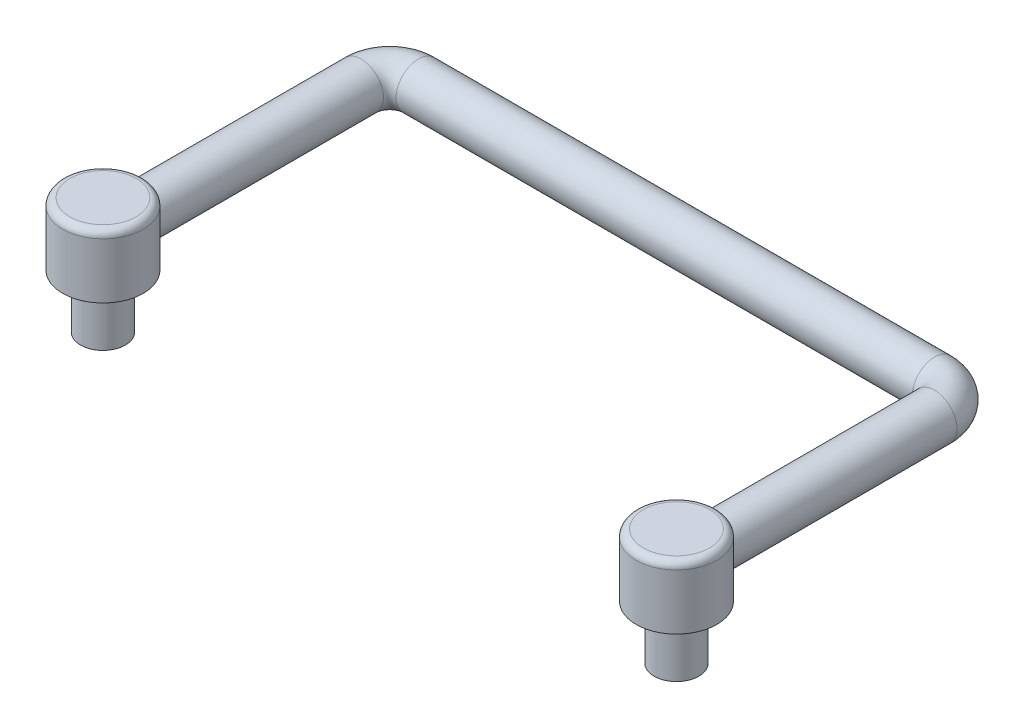
ISO-10303-21;
HEADER;
FILE_DESCRIPTION(('STEP AP214'),'2;1');
FILE_NAME('part.step','',(''),(''),'','','');
FILE_SCHEMA(('AUTOMOTIVE_DESIGN { 1 0 10303 214 1 1 1 1 }'));
ENDSEC;
DATA;
#1=APPLICATION_CONTEXT('core data for automotive mechanical design processes');
#2=APPLICATION_PROTOCOL_DEFINITION('international standard','automotive_design',2000,#1);
#3=PRODUCT_CONTEXT('',#1,'mechanical');
#4=PRODUCT('Part','Part','',(#3));
#5=PRODUCT_RELATED_PRODUCT_CATEGORY('part','',(#4));
#6=PRODUCT_DEFINITION_FORMATION('','',#4);
#7=PRODUCT_DEFINITION_CONTEXT('part definition',#1,'design');
#8=PRODUCT_DEFINITION('design','',#6,#7);
#9=PRODUCT_DEFINITION_SHAPE('','',#8);
#10=(LENGTH_UNIT() NAMED_UNIT(*) SI_UNIT(.MILLI.,.METRE.));
#11=(NAMED_UNIT(*) PLANE_ANGLE_UNIT() SI_UNIT($,.RADIAN.));
#12=(NAMED_UNIT(*) SI_UNIT($,.STERADIAN.) SOLID_ANGLE_UNIT());
#13=UNCERTAINTY_MEASURE_WITH_UNIT(LENGTH_MEASURE(1.E-05),#10,'distance_accuracy_value','');
#14=(GEOMETRIC_REPRESENTATION_CONTEXT(3) GLOBAL_UNCERTAINTY_ASSIGNED_CONTEXT((#13)) GLOBAL_UNIT_ASSIGNED_CONTEXT((#10,
#11,#12)) REPRESENTATION_CONTEXT('',''));
#15=CARTESIAN_POINT('',(0.,0.,0.));
#16=DIRECTION('',(0.,0.,1.));
#17=DIRECTION('',(1.,0.,0.));
#18=AXIS2_PLACEMENT_3D('',#15,#16,#17);
#19=CARTESIAN_POINT('',(101.6,-5.55625,0.));
#20=DIRECTION('',(0.,1.,0.));
#21=DIRECTION('',(0.,0.,1.));
#22=AXIS2_PLACEMENT_3D('',#19,#20,#21);
#23=PLANE('',#22);
#24=CARTESIAN_POINT('',(101.6,-5.55625,0.));
#25=DIRECTION('',(0.,1.,0.));
#26=DIRECTION('',(0.,0.,1.));
#27=AXIS2_PLACEMENT_3D('',#24,#25,#26);
#28=CIRCLE('',#27,7.14375);
#29=CARTESIAN_POINT('',(101.6,-5.55625,7.14375000000002));
#30=VERTEX_POINT('',#29);
#31=EDGE_CURVE('E115',#30,#30,#28,.T.);
#32=ORIENTED_EDGE('',*,*,#31,.F.);
#33=EDGE_LOOP('',(#32));
#34=FACE_BOUND('',#33,.T.);
#35=CARTESIAN_POINT('',(101.6,-5.55625,0.));
#36=DIRECTION('',(0.,1.,0.));
#37=DIRECTION('',(0.,0.,1.));
#38=AXIS2_PLACEMENT_3D('',#35,#36,#37);
#39=CIRCLE('',#38,3.96874999999999);
#40=CARTESIAN_POINT('',(101.6,-5.55625,3.96875));
#41=VERTEX_POINT('',#40);
#42=EDGE_CURVE('E49',#41,#41,#39,.F.);
#43=ORIENTED_EDGE('',*,*,#42,.F.);
#44=EDGE_LOOP('',(#43));
#45=FACE_BOUND('',#44,.T.);
#46=ADVANCED_FACE('F29',(#34,#45),#23,.F.);
#47=CARTESIAN_POINT('',(0.,-5.55625,0.));
#48=DIRECTION('',(0.,1.,0.));
#49=DIRECTION('',(0.,0.,1.));
#50=AXIS2_PLACEMENT_3D('',#47,#48,#49);
#51=PLANE('',#50);
#52=CARTESIAN_POINT('',(0.,-5.55625,0.));
#53=DIRECTION('',(0.,1.,0.));
#54=DIRECTION('',(0.,0.,1.));
#55=AXIS2_PLACEMENT_3D('',#52,#53,#54);
#56=CIRCLE('',#55,7.14375);
#57=CARTESIAN_POINT('',(0.,-5.55625,7.14375));
#58=VERTEX_POINT('',#57);
#59=EDGE_CURVE('E171',#58,#58,#56,.T.);
#60=ORIENTED_EDGE('',*,*,#59,.F.);
#61=EDGE_LOOP('',(#60));
#62=FACE_BOUND('',#61,.T.);
#63=CARTESIAN_POINT('',(0.,-5.55625,0.));
#64=DIRECTION('',(0.,1.,0.));
#65=DIRECTION('',(0.,0.,1.));
#66=AXIS2_PLACEMENT_3D('',#63,#64,#65);
#67=CIRCLE('',#66,3.96875);
#68=CARTESIAN_POINT('',(0.,-5.55625,3.96875));
#69=VERTEX_POINT('',#68);
#70=EDGE_CURVE('E52',#69,#69,#67,.F.);
#71=ORIENTED_EDGE('',*,*,#70,.F.);
#72=EDGE_LOOP('',(#71));
#73=FACE_BOUND('',#72,.T.);
#74=ADVANCED_FACE('F84',(#62,#73),#51,.F.);
#75=CARTESIAN_POINT('',(101.6,0.,-45.72));
#76=DIRECTION('',(0.,0.,1.));
#77=DIRECTION('',(1.,0.,0.));
#78=AXIS2_PLACEMENT_3D('',#75,#76,#77);
#79=CYLINDRICAL_SURFACE('',#78,3.96875);
#80=CARTESIAN_POINT('',(101.6,0.,-45.72));
#81=DIRECTION('',(0.,0.,-1.));
#82=DIRECTION('',(-1.,0.,0.));
#83=AXIS2_PLACEMENT_3D('',#80,#81,#82);
#84=CIRCLE('',#83,3.96875);
#85=CARTESIAN_POINT('',(105.56875,0.,-45.72));
#86=VERTEX_POINT('',#85);
#87=EDGE_CURVE('E62',#86,#86,#84,.T.);
#88=ORIENTED_EDGE('',*,*,#87,.F.);
#89=EDGE_LOOP('',(#88));
#90=FACE_BOUND('',#89,.T.);
#91=CARTESIAN_POINT('',(105.56875,0.,-5.93988110150362));
#92=CARTESIAN_POINT('',(105.568751409648,0.10154310785879,-5.93987919856));
#93=CARTESIAN_POINT('',(105.564848387252,0.203071550308421,-5.94249330192825));
#94=CARTESIAN_POINT('',(105.549302464966,0.405305419892145,-5.95283656101962));
#95=CARTESIAN_POINT('',(105.537657164327,0.506010581932672,-5.96056730332322));
#96=CARTESIAN_POINT('',(105.506782827201,0.70587533695,-5.98084875449036));
#97=CARTESIAN_POINT('',(105.487545031828,0.805033006872294,-5.99340502976651));
#98=CARTESIAN_POINT('',(105.441758711905,1.00100406381826,-6.02285561518068));
#99=CARTESIAN_POINT('',(105.41520690329,1.09781637645862,-6.03975187378329));
#100=CARTESIAN_POINT('',(105.325453479869,1.38250513248704,-6.09582993196987));
#101=CARTESIAN_POINT('',(105.251914916521,1.56613804072142,-6.14056849470107));
#102=CARTESIAN_POINT('',(105.079895377524,1.91828274678916,-6.23965517686694));
#103=CARTESIAN_POINT('',(104.981408861789,2.08679117472214,-6.29400542991858));
#104=CARTESIAN_POINT('',(104.750401224694,2.42317152934555,-6.41301136089922));
#105=CARTESIAN_POINT('',(104.615415402754,2.58917992122099,-6.47815163277469));
#106=CARTESIAN_POINT('',(104.320210094102,2.8977596971409,-6.60753735867565));
#107=CARTESIAN_POINT('',(104.159975271224,3.04031672863135,-6.67178224286228));
#108=CARTESIAN_POINT('',(103.895261893814,3.23981871057335,-6.765706829505));
#109=CARTESIAN_POINT('',(103.798611521444,3.30619219897231,-6.79780684441846));
#110=CARTESIAN_POINT('',(103.599162006307,3.43046896749411,-6.85910912065808));
#111=CARTESIAN_POINT('',(103.496365572429,3.48837594103726,-6.88831264374664));
#112=CARTESIAN_POINT('',(103.285258157871,3.59511738577668,-6.94297897014567));
#113=CARTESIAN_POINT('',(103.176949056945,3.64395492348432,-6.96844303721043));
#114=CARTESIAN_POINT('',(102.955546671429,3.73197722471938,-7.01487291628941));
#115=CARTESIAN_POINT('',(102.842454041393,3.77116330392791,-7.03583934136919));
#116=CARTESIAN_POINT('',(102.62213514465,3.83644107496012,-7.0710521748939));
#117=CARTESIAN_POINT('',(102.515220280813,3.86335924904474,-7.08571662347745));
#118=CARTESIAN_POINT('',(102.299000406175,3.90826849709986,-7.11030210802229));
#119=CARTESIAN_POINT('',(102.18969569487,3.9262606830545,-7.12022373483049));
#120=CARTESIAN_POINT('',(101.969693017797,3.95304636491659,-7.13502896605437));
#121=CARTESIAN_POINT('',(101.858995950662,3.96184551385102,-7.13991566654584));
#122=CARTESIAN_POINT('',(101.637151780249,3.97012793363459,-7.14451476562938));
#123=CARTESIAN_POINT('',(101.526004714364,3.96961196327747,-7.14422758567695));
#124=CARTESIAN_POINT('',(101.316161780101,3.9598270499417,-7.13879565087735));
#125=CARTESIAN_POINT('',(101.217407319422,3.95150149099343,-7.13417444873328));
#126=CARTESIAN_POINT('',(101.02105161751,3.92754318739781,-7.12093323406999));
#127=CARTESIAN_POINT('',(100.923450742155,3.91190818499788,-7.11231198601641));
#128=CARTESIAN_POINT('',(100.633471359293,3.85428789443376,-7.08072293600312));
#129=CARTESIAN_POINT('',(100.443720435358,3.80157777901108,-7.05202420805719));
#130=CARTESIAN_POINT('',(100.074414768247,3.66913258521544,-6.98151645479386));
#131=CARTESIAN_POINT('',(99.8949853294221,3.58912446039571,-6.93957530227558));
#132=CARTESIAN_POINT('',(99.5517352535383,3.40493014905276,-6.8461256186277));
#133=CARTESIAN_POINT('',(99.3879195423039,3.30073636781079,-6.7946140832469));
#134=CARTESIAN_POINT('',(99.0614322508916,3.05817012995434,-6.67996637541492));
#135=CARTESIAN_POINT('',(98.900840585291,2.91730736159206,-6.61617503366157));
#136=CARTESIAN_POINT('',(98.6043317141428,2.61196419245336,-6.4873204488594));
#137=CARTESIAN_POINT('',(98.4684409422316,2.44745882365875,-6.42225592480702));
#138=CARTESIAN_POINT('',(98.2127972464814,2.0813383462949,-6.2914593154622));
#139=CARTESIAN_POINT('',(98.0956270365767,1.87771048896516,-6.22620223726104));
#140=CARTESIAN_POINT('',(97.9474346904629,1.55681207299698,-6.13964318904894));
#141=CARTESIAN_POINT('',(97.9026255540995,1.44724897088753,-6.11267414648955));
#142=CARTESIAN_POINT('',(97.822721699869,1.22360718622362,-6.06362342643157));
#143=CARTESIAN_POINT('',(97.7876203433208,1.10953165082781,-6.04153841106421));
#144=CARTESIAN_POINT('',(97.7300735079042,0.887007581895807,-6.00482353308846));
#145=CARTESIAN_POINT('',(97.706841220248,0.778837159017298,-5.98973916657484));
#146=CARTESIAN_POINT('',(97.6694467104203,0.56035502928333,-5.96526755517972));
#147=CARTESIAN_POINT('',(97.655279147908,0.450044622709229,-5.95587695607541));
#148=CARTESIAN_POINT('',(97.6362646922972,0.228356015312485,-5.94323970930252));
#149=CARTESIAN_POINT('',(97.6314106086422,0.11697870502874,-5.9399883218303));
#150=CARTESIAN_POINT('',(97.6310972810745,-0.105787202868149,-5.93977915336859));
#151=CARTESIAN_POINT('',(97.6356369584761,-0.217175797716791,-5.9428206497671));
#152=CARTESIAN_POINT('',(97.6526366712029,-0.422175562040225,-5.95412209058083));
#153=CARTESIAN_POINT('',(97.6638047919883,-0.515944203638261,-5.96152969931841));
#154=CARTESIAN_POINT('',(97.6927011627008,-0.702048989504742,-5.98050770689929));
#155=CARTESIAN_POINT('',(97.7104315019882,-0.794384667761983,-5.9920794315328));
#156=CARTESIAN_POINT('',(97.7731682767473,-1.06834926637936,-6.03249916790604));
#157=CARTESIAN_POINT('',(97.8277298045571,-1.24704468952756,-6.06705843576853));
#158=CARTESIAN_POINT('',(97.9628650614989,-1.59982853618998,-6.14905293613567));
#159=CARTESIAN_POINT('',(98.0444188951653,-1.77342291253662,-6.19696046996845));
#160=CARTESIAN_POINT('',(98.2304378888948,-2.10553283559213,-6.30004107791264));
#161=CARTESIAN_POINT('',(98.3349142323768,-2.26404096772315,-6.35521769319037));
#162=CARTESIAN_POINT('',(98.5834738942484,-2.58840252145041,-6.47733612579224));
#163=CARTESIAN_POINT('',(98.7312333803934,-2.75127279507138,-6.54473401500145));
#164=CARTESIAN_POINT('',(99.0525591147211,-3.05119240844771,-6.67636096356092));
#165=CARTESIAN_POINT('',(99.226141192569,-3.18822579211152,-6.7405880467628));
#166=CARTESIAN_POINT('',(99.5083355985158,-3.37484663552342,-6.83144476868775));
#167=CARTESIAN_POINT('',(99.6088997385732,-3.43516165884034,-6.86150170823629));
#168=CARTESIAN_POINT('',(99.8157180785893,-3.54698669524419,-6.91816249829271));
#169=CARTESIAN_POINT('',(99.9219697063907,-3.59850064514978,-6.94476789142744));
#170=CARTESIAN_POINT('',(100.139409949139,-3.69210760070062,-6.9937298256553));
#171=CARTESIAN_POINT('',(100.250595559139,-3.73420624868883,-7.01608891023107));
#172=CARTESIAN_POINT('',(100.477097453947,-3.80844609745222,-7.05588161331109));
#173=CARTESIAN_POINT('',(100.592413108438,-3.8405888105123,-7.07331597983386));
#174=CARTESIAN_POINT('',(100.814130028827,-3.89165340873626,-7.10117921080758));
#175=CARTESIAN_POINT('',(100.920230191597,-3.91159420813783,-7.11214373453954));
#176=CARTESIAN_POINT('',(101.134075136952,-3.94278609654451,-7.12934635501571));
#177=CARTESIAN_POINT('',(101.241819737596,-3.95403813986927,-7.13558497082322));
#178=CARTESIAN_POINT('',(101.457992898749,-3.96768634751504,-7.14315688048232));
#179=CARTESIAN_POINT('',(101.566421137186,-3.97008640932122,-7.14449233317205));
#180=CARTESIAN_POINT('',(101.783054057641,-3.96600604327453,-7.14222574398426));
#181=CARTESIAN_POINT('',(101.891258751222,-3.95952608685848,-7.13862396422255));
#182=CARTESIAN_POINT('',(102.096544820916,-3.93878842848649,-7.12714350316994));
#183=CARTESIAN_POINT('',(102.193729174876,-3.92530571566202,-7.11969131001741));
#184=CARTESIAN_POINT('',(102.386491826716,-3.89127257963581,-7.10098540561767));
#185=CARTESIAN_POINT('',(102.482069577598,-3.87071979844071,-7.08973042609597));
#186=CARTESIAN_POINT('',(102.765384914079,-3.79878041948039,-7.05062076933277));
#187=CARTESIAN_POINT('',(102.949885471299,-3.737094053141,-7.01741059308218));
#188=CARTESIAN_POINT('',(103.311589190027,-3.58624701809033,-6.93823598323555));
#189=CARTESIAN_POINT('',(103.488353468391,-3.49625030730817,-6.89188837475215));
#190=CARTESIAN_POINT('',(103.82485575425,-3.29237371819386,-6.79073440624468));
#191=CARTESIAN_POINT('',(103.984587014079,-3.17848442739124,-6.73592471484089));
#192=CARTESIAN_POINT('',(104.302211921362,-2.91486419931205,-6.61538535704771));
#193=CARTESIAN_POINT('',(104.457726790535,-2.7625042114764,-6.54912725232471));
#194=CARTESIAN_POINT('',(104.74218968499,-2.43412053887145,-6.41750911315025));
#195=CARTESIAN_POINT('',(104.871104360243,-2.2580676002332,-6.35215030080969));
#196=CARTESIAN_POINT('',(105.107498887048,-1.87166128050803,-6.22494328358201));
#197=CARTESIAN_POINT('',(105.21281932975,-1.65976295470177,-6.16366984158239));
#198=CARTESIAN_POINT('',(105.341860633221,-1.32798642890901,-6.08557015643079));
#199=CARTESIAN_POINT('',(105.380032116061,-1.21516885672612,-6.06185218457211));
#200=CARTESIAN_POINT('',(105.446267781337,-0.985616493762623,-6.02004361588464));
#201=CARTESIAN_POINT('',(105.474338317527,-0.868884216133881,-6.00194948249676));
#202=CARTESIAN_POINT('',(105.520795786,-0.627716888452163,-5.97171087445435));
#203=CARTESIAN_POINT('',(105.538740996928,-0.503161867742405,-5.95983920592238));
#204=CARTESIAN_POINT('',(105.562716913704,-0.252396957014114,-5.9439257084126));
#205=CARTESIAN_POINT('',(105.568748248237,-0.12618715467079,-5.93988346628295));
#206=CARTESIAN_POINT('',(105.56875,0.,-5.93988110150362));
#207=B_SPLINE_CURVE_WITH_KNOTS('',3,(#91,#92,#93,#94,#95,#96,#97,#98,#99,#100,#101,#102,#103,
#104,#105,#106,#107,#108,#109,#110,#111,#112,#113,#114,#115,#116,#117,#118,#119,#120,#121,#122,
#123,#124,#125,#126,#127,#128,#129,#130,#131,#132,#133,#134,#135,#136,#137,#138,#139,#140,#141,
#142,#143,#144,#145,#146,#147,#148,#149,#150,#151,#152,#153,#154,#155,#156,#157,#158,#159,#160,
#161,#162,#163,#164,#165,#166,#167,#168,#169,#170,#171,#172,#173,#174,#175,#176,#177,#178,#179,
#180,#181,#182,#183,#184,#185,#186,#187,#188,#189,#190,#191,#192,#193,#194,#195,#196,#197,#198,
#199,#200,#201,#202,#203,#204,#205,#206),.UNSPECIFIED.,.T.,.F.,(4,2,2,2,2,2,2,2,2,2,2,2,2,2,2,2,
2,2,2,2,2,2,2,2,2,2,2,2,2,2,2,2,2,2,2,2,2,2,2,2,2,2,2,2,2,2,2,2,2,2,2,2,2,2,2,2,2,4),(0.,
0.304496202057433,0.609086867338606,0.914029947827567,1.21911017457986,1.82473108872661,
2.43048660861672,3.09881068151615,3.76754226833777,4.1318178820723,4.49593410753673,
4.85992699483236,5.22387023533642,5.55707123964491,5.89023072391896,6.22318521934761,
6.55611259299264,6.85338260838217,7.15074450573748,7.74488783921119,8.34515729343877,
8.94561549837467,9.61166865114213,10.2784304366901,11.0056856111177,11.3694425923537,
11.732950199201,12.0674294552277,12.4017114761557,12.7357353075757,13.06972078516,
13.3535466273149,13.637462915304,14.2049708485023,14.7958869294911,15.3870919498466,
16.0742492739709,16.7618295858104,17.1245760202442,17.4871597668786,17.8495256408817,
18.2118364452719,18.5369295139337,18.8619868712872,19.1869010903416,19.5117980604904,
19.8066383133322,20.1015769961265,20.6909144870074,21.2996136867933,21.9085531351599,
22.5883838666034,23.2690618260858,23.9978566482869,24.3616705925782,24.7252552868666,
25.1036712905966,25.4820673251076),.UNSPECIFIED.);
#208=CARTESIAN_POINT('',(105.56875,0.,-5.93988110150362));
#209=VERTEX_POINT('',#208);
#210=EDGE_CURVE('E55',#209,#209,#207,.T.);
#211=ORIENTED_EDGE('',*,*,#210,.F.);
#212=EDGE_LOOP('',(#211));
#213=FACE_BOUND('',#212,.T.);
#214=ADVANCED_FACE('F69',(#90,#213),#79,.T.);
#215=CARTESIAN_POINT('',(0.,0.,-45.72));
#216=DIRECTION('',(0.,0.,1.));
#217=DIRECTION('',(1.,0.,0.));
#218=AXIS2_PLACEMENT_3D('',#215,#216,#217);
#219=CYLINDRICAL_SURFACE('',#218,3.96875);
#220=CARTESIAN_POINT('',(0.,0.,-45.72));
#221=DIRECTION('',(0.,0.,1.));
#222=DIRECTION('',(1.,0.,0.));
#223=AXIS2_PLACEMENT_3D('',#220,#221,#222);
#224=CIRCLE('',#223,3.96875);
#225=CARTESIAN_POINT('',(-3.96875,0.,-45.72));
#226=VERTEX_POINT('',#225);
#227=EDGE_CURVE('E168',#226,#226,#224,.T.);
#228=ORIENTED_EDGE('',*,*,#227,.T.);
#229=EDGE_LOOP('',(#228));
#230=FACE_BOUND('',#229,.T.);
#231=CARTESIAN_POINT('',(3.96875,0.,-5.93988110150363));
#232=CARTESIAN_POINT('',(3.96875140964818,-0.10154310785879,-5.93987919856001));
#233=CARTESIAN_POINT('',(3.96484838725206,-0.20307155030842,-5.94249330192826));
#234=CARTESIAN_POINT('',(3.94930246496649,-0.405305419892143,-5.95283656101964));
#235=CARTESIAN_POINT('',(3.93765716432657,-0.50601058193267,-5.96056730332323));
#236=CARTESIAN_POINT('',(3.9067828272015,-0.705875336949998,-5.98084875449037));
#237=CARTESIAN_POINT('',(3.88754503182847,-0.805033006872292,-5.99340502976652));
#238=CARTESIAN_POINT('',(3.84175871190494,-1.00100406381825,-6.02285561518069));
#239=CARTESIAN_POINT('',(3.81520690329046,-1.09781637645862,-6.03975187378331));
#240=CARTESIAN_POINT('',(3.72545347986857,-1.38250513248704,-6.09582993196989));
#241=CARTESIAN_POINT('',(3.65191491652115,-1.56613804072142,-6.14056849470108));
#242=CARTESIAN_POINT('',(3.47989537752423,-1.91828274678917,-6.23965517686696));
#243=CARTESIAN_POINT('',(3.38140886178888,-2.08679117472215,-6.29400542991859));
#244=CARTESIAN_POINT('',(3.1504012246937,-2.42317152934555,-6.41301136089923));
#245=CARTESIAN_POINT('',(3.01541540275447,-2.589179921221,-6.4781516327747));
#246=CARTESIAN_POINT('',(2.72021009410213,-2.8977596971409,-6.60753735867566));
#247=CARTESIAN_POINT('',(2.5599752712245,-3.04031672863135,-6.67178224286229));
#248=CARTESIAN_POINT('',(2.29526189381383,-3.23981871057336,-6.76570682950501));
#249=CARTESIAN_POINT('',(2.19861152144432,-3.30619219897231,-6.79780684441847));
#250=CARTESIAN_POINT('',(1.99916200630741,-3.43046896749411,-6.85910912065809));
#251=CARTESIAN_POINT('',(1.89636557242922,-3.48837594103726,-6.88831264374666));
#252=CARTESIAN_POINT('',(1.68525815787126,-3.59511738577668,-6.94297897014568));
#253=CARTESIAN_POINT('',(1.57694905694513,-3.64395492348432,-6.96844303721044));
#254=CARTESIAN_POINT('',(1.35554667142912,-3.73197722471938,-7.01487291628942));
#255=CARTESIAN_POINT('',(1.24245404139267,-3.77116330392791,-7.03583934136921));
#256=CARTESIAN_POINT('',(1.02213514465045,-3.83644107496012,-7.07105217489391));
#257=CARTESIAN_POINT('',(0.915220280813394,-3.86335924904474,-7.08571662347746));
#258=CARTESIAN_POINT('',(0.699000406175316,-3.90826849709986,-7.1103021080223));
#259=CARTESIAN_POINT('',(0.589695694869608,-3.9262606830545,-7.1202237348305));
#260=CARTESIAN_POINT('',(0.369693017796871,-3.95304636491659,-7.13502896605439));
#261=CARTESIAN_POINT('',(0.258995950662238,-3.96184551385102,-7.13991566654585));
#262=CARTESIAN_POINT('',(0.0371517802489051,-3.97012793363459,-7.14451476562939));
#263=CARTESIAN_POINT('',(-0.0739952856362645,-3.96961196327747,-7.14422758567696));
#264=CARTESIAN_POINT('',(-0.283838219899151,-3.9598270499417,-7.13879565087736));
#265=CARTESIAN_POINT('',(-0.382592680578017,-3.95150149099343,-7.13417444873329));
#266=CARTESIAN_POINT('',(-0.578948382489964,-3.92754318739781,-7.12093323407));
#267=CARTESIAN_POINT('',(-0.676549257844776,-3.91190818499788,-7.11231198601642));
#268=CARTESIAN_POINT('',(-0.96652864070748,-3.85428789443375,-7.08072293600313));
#269=CARTESIAN_POINT('',(-1.15627956464202,-3.80157777901108,-7.0520242080572));
#270=CARTESIAN_POINT('',(-1.52558523175282,-3.66913258521544,-6.98151645479387));
#271=CARTESIAN_POINT('',(-1.70501467057796,-3.5891244603957,-6.93957530227559));
#272=CARTESIAN_POINT('',(-2.04826474646166,-3.40493014905275,-6.84612561862771));
#273=CARTESIAN_POINT('',(-2.21208045769608,-3.30073636781078,-6.79461408324691));
#274=CARTESIAN_POINT('',(-2.53856774910837,-3.05817012995433,-6.67996637541493));
#275=CARTESIAN_POINT('',(-2.69915941470902,-2.91730736159205,-6.61617503366158));
#276=CARTESIAN_POINT('',(-2.99566828585719,-2.61196419245335,-6.48732044885941));
#277=CARTESIAN_POINT('',(-3.13155905776838,-2.44745882365874,-6.42225592480703));
#278=CARTESIAN_POINT('',(-3.38720275351859,-2.0813383462949,-6.29145931546221));
#279=CARTESIAN_POINT('',(-3.50437296342328,-1.87771048896516,-6.22620223726105));
#280=CARTESIAN_POINT('',(-3.65256530953707,-1.55681207299698,-6.13964318904894));
#281=CARTESIAN_POINT('',(-3.69737444590048,-1.44724897088752,-6.11267414648956));
#282=CARTESIAN_POINT('',(-3.77727830013095,-1.22360718622362,-6.06362342643159));
#283=CARTESIAN_POINT('',(-3.81237965667924,-1.10953165082781,-6.04153841106423));
#284=CARTESIAN_POINT('',(-3.86992649209582,-0.887007581895808,-6.00482353308847));
#285=CARTESIAN_POINT('',(-3.89315877975201,-0.778837159017297,-5.98973916657485));
#286=CARTESIAN_POINT('',(-3.93055328957967,-0.560355029283328,-5.96526755517974));
#287=CARTESIAN_POINT('',(-3.94472085209195,-0.450044622709228,-5.95587695607542));
#288=CARTESIAN_POINT('',(-3.96373530770274,-0.228356015312484,-5.94323970930254));
#289=CARTESIAN_POINT('',(-3.96858939135783,-0.116978705028739,-5.93998832183031));
#290=CARTESIAN_POINT('',(-3.96890271892553,0.105787202868151,-5.9397791533686));
#291=CARTESIAN_POINT('',(-3.96436304152393,0.217175797716791,-5.94282064976711));
#292=CARTESIAN_POINT('',(-3.94736332879711,0.422175562040224,-5.95412209058084));
#293=CARTESIAN_POINT('',(-3.93619520801168,0.515944203638258,-5.96152969931842));
#294=CARTESIAN_POINT('',(-3.90729883729919,0.702048989504739,-5.9805077068993));
#295=CARTESIAN_POINT('',(-3.88956849801176,0.79438466776198,-5.99207943153281));
#296=CARTESIAN_POINT('',(-3.82683172325272,1.06834926637936,-6.03249916790605));
#297=CARTESIAN_POINT('',(-3.77227019544293,1.24704468952756,-6.06705843576854));
#298=CARTESIAN_POINT('',(-3.63713493850106,1.59982853618998,-6.14905293613568));
#299=CARTESIAN_POINT('',(-3.5555811048347,1.77342291253662,-6.19696046996846));
#300=CARTESIAN_POINT('',(-3.36956211110518,2.10553283559213,-6.30004107791266));
#301=CARTESIAN_POINT('',(-3.26508576762321,2.26404096772315,-6.35521769319039));
#302=CARTESIAN_POINT('',(-3.0165261057516,2.58840252145041,-6.47733612579225));
#303=CARTESIAN_POINT('',(-2.86876661960663,2.75127279507138,-6.54473401500146));
#304=CARTESIAN_POINT('',(-2.54744088527894,3.05119240844771,-6.67636096356093));
#305=CARTESIAN_POINT('',(-2.37385880743095,3.18822579211151,-6.74058804676281));
#306=CARTESIAN_POINT('',(-2.09166440148419,3.37484663552341,-6.83144476868776));
#307=CARTESIAN_POINT('',(-1.99110026142678,3.43516165884033,-6.8615017082363));
#308=CARTESIAN_POINT('',(-1.78428192141075,3.54698669524418,-6.91816249829272));
#309=CARTESIAN_POINT('',(-1.67803029360931,3.59850064514977,-6.94476789142745));
#310=CARTESIAN_POINT('',(-1.46059005086141,3.69210760070062,-6.99372982565531));
#311=CARTESIAN_POINT('',(-1.34940444086087,3.73420624868883,-7.01608891023108));
#312=CARTESIAN_POINT('',(-1.12290254605312,3.80844609745222,-7.0558816133111));
#313=CARTESIAN_POINT('',(-1.00758689156239,3.8405888105123,-7.07331597983387));
#314=CARTESIAN_POINT('',(-0.785869971172833,3.89165340873625,-7.10117921080759));
#315=CARTESIAN_POINT('',(-0.679769808403233,3.91159420813783,-7.11214373453955));
#316=CARTESIAN_POINT('',(-0.465924863048432,3.94278609654451,-7.12934635501572));
#317=CARTESIAN_POINT('',(-0.35818026240418,3.95403813986927,-7.13558497082323));
#318=CARTESIAN_POINT('',(-0.142007101250849,3.96768634751504,-7.14315688048234));
#319=CARTESIAN_POINT('',(-0.0335788628143511,3.97008640932122,-7.14449233317207));
#320=CARTESIAN_POINT('',(0.183054057640833,3.96600604327453,-7.14222574398427));
#321=CARTESIAN_POINT('',(0.291258751222005,3.95952608685848,-7.13862396422256));
#322=CARTESIAN_POINT('',(0.496544820916161,3.93878842848649,-7.12714350316995));
#323=CARTESIAN_POINT('',(0.593729174875697,3.92530571566202,-7.11969131001742));
#324=CARTESIAN_POINT('',(0.78649182671623,3.89127257963581,-7.10098540561768));
#325=CARTESIAN_POINT('',(0.882069577597618,3.87071979844071,-7.08973042609598));
#326=CARTESIAN_POINT('',(1.16538491407859,3.79878041948039,-7.05062076933278));
#327=CARTESIAN_POINT('',(1.34988547129935,3.737094053141,-7.01741059308219));
#328=CARTESIAN_POINT('',(1.7115891900271,3.58624701809034,-6.93823598323557));
#329=CARTESIAN_POINT('',(1.88835346839061,3.49625030730817,-6.89188837475216));
#330=CARTESIAN_POINT('',(2.22485575424971,3.29237371819386,-6.79073440624469));
#331=CARTESIAN_POINT('',(2.38458701407924,3.17848442739123,-6.7359247148409));
#332=CARTESIAN_POINT('',(2.70221192136191,2.91486419931205,-6.61538535704772));
#333=CARTESIAN_POINT('',(2.85772679053483,2.76250421147639,-6.54912725232472));
#334=CARTESIAN_POINT('',(3.14218968498968,2.43412053887145,-6.41750911315026));
#335=CARTESIAN_POINT('',(3.27110436024272,2.2580676002332,-6.35215030080971));
#336=CARTESIAN_POINT('',(3.50749888704797,1.87166128050803,-6.22494328358202));
#337=CARTESIAN_POINT('',(3.61281932974976,1.65976295470177,-6.1636698415824));
#338=CARTESIAN_POINT('',(3.74186063322066,1.327986428909,-6.0855701564308));
#339=CARTESIAN_POINT('',(3.78003211606064,1.21516885672611,-6.06185218457212));
#340=CARTESIAN_POINT('',(3.84626778133652,0.985616493762617,-6.02004361588465));
#341=CARTESIAN_POINT('',(3.87433831752694,0.868884216133875,-6.00194948249677));
#342=CARTESIAN_POINT('',(3.92079578599953,0.627716888452158,-5.97171087445436));
#343=CARTESIAN_POINT('',(3.93874099692828,0.503161867742401,-5.95983920592239));
#344=CARTESIAN_POINT('',(3.96271691370437,0.252396957014113,-5.94392570841261));
#345=CARTESIAN_POINT('',(3.96874824823667,0.12618715467079,-5.93988346628295));
#346=CARTESIAN_POINT('',(3.96875,0.,-5.93988110150363));
#347=B_SPLINE_CURVE_WITH_KNOTS('',3,(#231,#232,#233,#234,#235,#236,#237,#238,#239,#240,#241,
#242,#243,#244,#245,#246,#247,#248,#249,#250,#251,#252,#253,#254,#255,#256,#257,#258,#259,#260,
#261,#262,#263,#264,#265,#266,#267,#268,#269,#270,#271,#272,#273,#274,#275,#276,#277,#278,#279,
#280,#281,#282,#283,#284,#285,#286,#287,#288,#289,#290,#291,#292,#293,#294,#295,#296,#297,#298,
#299,#300,#301,#302,#303,#304,#305,#306,#307,#308,#309,#310,#311,#312,#313,#314,#315,#316,#317,
#318,#319,#320,#321,#322,#323,#324,#325,#326,#327,#328,#329,#330,#331,#332,#333,#334,#335,#336,
#337,#338,#339,#340,#341,#342,#343,#344,#345,#346),.UNSPECIFIED.,.T.,.F.,(4,2,2,2,2,2,2,2,2,2,2,
2,2,2,2,2,2,2,2,2,2,2,2,2,2,2,2,2,2,2,2,2,2,2,2,2,2,2,2,2,2,2,2,2,2,2,2,2,2,2,2,2,2,2,2,2,2,4),
(0.,0.304496202057431,0.609086867338604,0.914029947827566,1.21911017457986,1.82473108872661,
2.43048660861672,3.09881068151616,3.76754226833777,4.1318178820723,4.49593410753673,
4.85992699483235,5.22387023533642,5.55707123964491,5.89023072391897,6.22318521934761,
6.55611259299264,6.85338260838218,7.15074450573749,7.7448878392112,8.34515729343878,
8.94561549837469,9.61166865114215,10.2784304366901,11.0056856111177,11.3694425923537,
11.732950199201,12.0674294552277,12.4017114761557,12.7357353075757,13.06972078516,
13.3535466273149,13.637462915304,14.2049708485023,14.7958869294912,15.3870919498466,
16.0742492739709,16.7618295858104,17.1245760202442,17.4871597668786,17.8495256408817,
18.2118364452719,18.5369295139337,18.8619868712871,19.1869010903416,19.5117980604904,
19.8066383133321,20.1015769961265,20.6909144870074,21.2996136867933,21.9085531351599,
22.5883838666034,23.2690618260858,23.9978566482869,24.3616705925782,24.7252552868666,
25.1036712905966,25.4820673251076),.UNSPECIFIED.);
#348=CARTESIAN_POINT('',(3.96875,0.,-5.93988110150363));
#349=VERTEX_POINT('',#348);
#350=EDGE_CURVE('E63',#349,#349,#347,.T.);
#351=ORIENTED_EDGE('',*,*,#350,.T.);
#352=EDGE_LOOP('',(#351));
#353=FACE_BOUND('',#352,.T.);
#354=ADVANCED_FACE('F90',(#230,#353),#219,.T.);
#355=CARTESIAN_POINT('',(96.52,0.,-45.72));
#356=DIRECTION('',(0.,-1.,0.));
#357=DIRECTION('',(0.,0.,-1.));
#358=AXIS2_PLACEMENT_3D('',#355,#356,#357);
#359=TOROIDAL_SURFACE('',#358,5.08,3.96875);
#360=CARTESIAN_POINT('',(96.52,0.,-50.8));
#361=DIRECTION('',(-1.,0.,0.));
#362=DIRECTION('',(0.,0.,1.));
#363=AXIS2_PLACEMENT_3D('',#360,#361,#362);
#364=CIRCLE('',#363,3.96875);
#365=CARTESIAN_POINT('',(96.52,0.,-54.76875));
#366=VERTEX_POINT('',#365);
#367=EDGE_CURVE('E161',#366,#366,#364,.T.);
#368=CARTESIAN_POINT('',(96.52,0.,-45.72));
#369=DIRECTION('',(0.,-1.,0.));
#370=DIRECTION('',(0.,0.,-1.));
#371=AXIS2_PLACEMENT_3D('',#368,#369,#370);
#372=CIRCLE('',#371,9.04875);
#373=EDGE_CURVE('',#366,#86,#372,.T.);
#374=ORIENTED_EDGE('',*,*,#367,.F.);
#375=ORIENTED_EDGE('',*,*,#87,.T.);
#376=ORIENTED_EDGE('',*,*,#373,.T.);
#377=ORIENTED_EDGE('',*,*,#373,.F.);
#378=EDGE_LOOP('',(#374,#376,#375,#377));
#379=FACE_BOUND('',#378,.T.);
#380=ADVANCED_FACE('F94',(#379),#359,.T.);
#381=CARTESIAN_POINT('',(5.08,0.,-50.8));
#382=DIRECTION('',(1.,0.,0.));
#383=DIRECTION('',(0.,0.,-1.));
#384=AXIS2_PLACEMENT_3D('',#381,#382,#383);
#385=CYLINDRICAL_SURFACE('',#384,3.96875);
#386=CARTESIAN_POINT('',(5.08,0.,-50.8));
#387=DIRECTION('',(-1.,0.,0.));
#388=DIRECTION('',(0.,0.,1.));
#389=AXIS2_PLACEMENT_3D('',#386,#387,#388);
#390=CIRCLE('',#389,3.96875);
#391=CARTESIAN_POINT('',(5.08,0.,-54.76875));
#392=VERTEX_POINT('',#391);
#393=EDGE_CURVE('E163',#392,#392,#390,.T.);
#394=ORIENTED_EDGE('',*,*,#393,.F.);
#395=EDGE_LOOP('',(#394));
#396=FACE_BOUND('',#395,.T.);
#397=ORIENTED_EDGE('',*,*,#367,.T.);
#398=EDGE_LOOP('',(#397));
#399=FACE_BOUND('',#398,.T.);
#400=ADVANCED_FACE('F98',(#396,#399),#385,.T.);
#401=CARTESIAN_POINT('',(5.08,0.,-45.72));
#402=DIRECTION('',(0.,-1.,0.));
#403=DIRECTION('',(0.,0.,-1.));
#404=AXIS2_PLACEMENT_3D('',#401,#402,#403);
#405=TOROIDAL_SURFACE('',#404,5.08,3.96875);
#406=CARTESIAN_POINT('',(5.08,0.,-45.72));
#407=DIRECTION('',(0.,-1.,0.));
#408=DIRECTION('',(0.,0.,-1.));
#409=AXIS2_PLACEMENT_3D('',#406,#407,#408);
#410=CIRCLE('',#409,9.04875);
#411=EDGE_CURVE('',#226,#392,#410,.T.);
#412=ORIENTED_EDGE('',*,*,#227,.F.);
#413=ORIENTED_EDGE('',*,*,#393,.T.);
#414=ORIENTED_EDGE('',*,*,#411,.T.);
#415=ORIENTED_EDGE('',*,*,#411,.F.);
#416=EDGE_LOOP('',(#412,#414,#413,#415));
#417=FACE_BOUND('',#416,.T.);
#418=ADVANCED_FACE('F89',(#417),#405,.T.);
#419=CARTESIAN_POINT('',(0.,5.55625,0.));
#420=DIRECTION('',(0.,-1.,0.));
#421=DIRECTION('',(0.,0.,-1.));
#422=AXIS2_PLACEMENT_3D('',#419,#420,#421);
#423=CYLINDRICAL_SURFACE('',#422,7.14375);
#424=CARTESIAN_POINT('',(0.,4.28625,0.));
#425=DIRECTION('',(0.,1.,0.));
#426=DIRECTION('',(0.,0.,1.));
#427=AXIS2_PLACEMENT_3D('',#424,#425,#426);
#428=CIRCLE('',#427,7.14375);
#429=CARTESIAN_POINT('',(0.,4.28625,7.14375));
#430=VERTEX_POINT('',#429);
#431=EDGE_CURVE('E10',#430,#430,#428,.F.);
#432=ORIENTED_EDGE('',*,*,#431,.T.);
#433=EDGE_LOOP('',(#432));
#434=FACE_BOUND('',#433,.T.);
#435=ORIENTED_EDGE('',*,*,#350,.F.);
#436=EDGE_LOOP('',(#435));
#437=FACE_BOUND('',#436,.T.);
#438=ORIENTED_EDGE('',*,*,#59,.T.);
#439=EDGE_LOOP('',(#438));
#440=FACE_BOUND('',#439,.T.);
#441=ADVANCED_FACE('F83',(#434,#437,#440),#423,.T.);
#442=CARTESIAN_POINT('',(0.,5.55625,0.));
#443=DIRECTION('',(0.,1.,0.));
#444=DIRECTION('',(0.,0.,1.));
#445=AXIS2_PLACEMENT_3D('',#442,#443,#444);
#446=PLANE('',#445);
#447=CARTESIAN_POINT('',(0.,5.55625,0.));
#448=DIRECTION('',(0.,1.,0.));
#449=DIRECTION('',(0.,0.,1.));
#450=AXIS2_PLACEMENT_3D('',#447,#448,#449);
#451=CIRCLE('',#450,5.87375);
#452=CARTESIAN_POINT('',(0.,5.55625,5.87375));
#453=VERTEX_POINT('',#452);
#454=EDGE_CURVE('E36',#453,#453,#451,.T.);
#455=ORIENTED_EDGE('',*,*,#454,.T.);
#456=EDGE_LOOP('',(#455));
#457=FACE_BOUND('',#456,.T.);
#458=ADVANCED_FACE('F78',(#457),#446,.T.);
#459=CARTESIAN_POINT('',(101.6,5.55625,0.));
#460=DIRECTION('',(0.,-1.,0.));
#461=DIRECTION('',(0.,0.,-1.));
#462=AXIS2_PLACEMENT_3D('',#459,#460,#461);
#463=CYLINDRICAL_SURFACE('',#462,7.14375);
#464=CARTESIAN_POINT('',(101.6,4.28625,0.));
#465=DIRECTION('',(0.,1.,0.));
#466=DIRECTION('',(0.,0.,1.));
#467=AXIS2_PLACEMENT_3D('',#464,#465,#466);
#468=CIRCLE('',#467,7.14375);
#469=CARTESIAN_POINT('',(101.6,4.28625,7.14375000000002));
#470=VERTEX_POINT('',#469);
#471=EDGE_CURVE('E40',#470,#470,#468,.F.);
#472=ORIENTED_EDGE('',*,*,#471,.T.);
#473=EDGE_LOOP('',(#472));
#474=FACE_BOUND('',#473,.T.);
#475=ORIENTED_EDGE('',*,*,#31,.T.);
#476=EDGE_LOOP('',(#475));
#477=FACE_BOUND('',#476,.T.);
#478=ORIENTED_EDGE('',*,*,#210,.T.);
#479=EDGE_LOOP('',(#478));
#480=FACE_BOUND('',#479,.T.);
#481=ADVANCED_FACE('F72',(#474,#477,#480),#463,.T.);
#482=CARTESIAN_POINT('',(101.6,5.55625,0.));
#483=DIRECTION('',(0.,1.,0.));
#484=DIRECTION('',(0.,0.,1.));
#485=AXIS2_PLACEMENT_3D('',#482,#483,#484);
#486=PLANE('',#485);
#487=CARTESIAN_POINT('',(101.6,5.55625,0.));
#488=DIRECTION('',(0.,1.,0.));
#489=DIRECTION('',(0.,0.,1.));
#490=AXIS2_PLACEMENT_3D('',#487,#488,#489);
#491=CIRCLE('',#490,5.87375);
#492=CARTESIAN_POINT('',(101.6,5.55625,5.87375000000002));
#493=VERTEX_POINT('',#492);
#494=EDGE_CURVE('E44',#493,#493,#491,.T.);
#495=ORIENTED_EDGE('',*,*,#494,.T.);
#496=EDGE_LOOP('',(#495));
#497=FACE_BOUND('',#496,.T.);
#498=ADVANCED_FACE('F77',(#497),#486,.T.);
#499=CARTESIAN_POINT('',(0.,-15.08125,0.));
#500=DIRECTION('',(0.,1.,0.));
#501=DIRECTION('',(0.,0.,1.));
#502=AXIS2_PLACEMENT_3D('',#499,#500,#501);
#503=CYLINDRICAL_SURFACE('',#502,3.96875);
#504=CARTESIAN_POINT('',(0.,-15.08125,0.));
#505=DIRECTION('',(0.,-1.,0.));
#506=DIRECTION('',(0.,0.,-1.));
#507=AXIS2_PLACEMENT_3D('',#504,#505,#506);
#508=CIRCLE('',#507,3.96875);
#509=CARTESIAN_POINT('',(0.,-15.08125,3.96875));
#510=VERTEX_POINT('',#509);
#511=EDGE_CURVE('E175',#510,#510,#508,.T.);
#512=CARTESIAN_POINT('',(0.,-15.08125,3.96875));
#513=CARTESIAN_POINT('',(0.,-14.98203125,3.96875));
#514=CARTESIAN_POINT('',(0.,-14.8828125,3.96875));
#515=CARTESIAN_POINT('',(0.,-14.684375,3.96875));
#516=CARTESIAN_POINT('',(0.,-14.58515625,3.96875));
#517=CARTESIAN_POINT('',(0.,-14.38671875,3.96875));
#518=CARTESIAN_POINT('',(0.,-14.2875,3.96875));
#519=CARTESIAN_POINT('',(0.,-14.0890625,3.96875));
#520=CARTESIAN_POINT('',(0.,-13.98984375,3.96875));
#521=CARTESIAN_POINT('',(0.,-13.79140625,3.96875));
#522=CARTESIAN_POINT('',(0.,-13.6921875,3.96875));
#523=CARTESIAN_POINT('',(0.,-13.49375,3.96875));
#524=CARTESIAN_POINT('',(0.,-13.39453125,3.96875));
#525=CARTESIAN_POINT('',(0.,-13.19609375,3.96875));
#526=CARTESIAN_POINT('',(0.,-13.096875,3.96875));
#527=CARTESIAN_POINT('',(0.,-12.8984375,3.96875));
#528=CARTESIAN_POINT('',(0.,-12.79921875,3.96875));
#529=CARTESIAN_POINT('',(0.,-12.60078125,3.96875));
#530=CARTESIAN_POINT('',(0.,-12.5015625,3.96875));
#531=CARTESIAN_POINT('',(0.,-12.303125,3.96875));
#532=CARTESIAN_POINT('',(0.,-12.20390625,3.96875));
#533=CARTESIAN_POINT('',(0.,-12.00546875,3.96875));
#534=CARTESIAN_POINT('',(0.,-11.90625,3.96875));
#535=CARTESIAN_POINT('',(0.,-11.7078125,3.96875));
#536=CARTESIAN_POINT('',(0.,-11.60859375,3.96875));
#537=CARTESIAN_POINT('',(0.,-11.41015625,3.96875));
#538=CARTESIAN_POINT('',(0.,-11.3109375,3.96875));
#539=CARTESIAN_POINT('',(0.,-11.1125,3.96875));
#540=CARTESIAN_POINT('',(0.,-11.01328125,3.96875));
#541=CARTESIAN_POINT('',(0.,-10.81484375,3.96875));
#542=CARTESIAN_POINT('',(0.,-10.715625,3.96875));
#543=CARTESIAN_POINT('',(0.,-10.5171875,3.96875));
#544=CARTESIAN_POINT('',(0.,-10.41796875,3.96875));
#545=CARTESIAN_POINT('',(0.,-10.21953125,3.96875));
#546=CARTESIAN_POINT('',(0.,-10.1203125,3.96875));
#547=CARTESIAN_POINT('',(0.,-9.921875,3.96875));
#548=CARTESIAN_POINT('',(0.,-9.82265625,3.96875));
#549=CARTESIAN_POINT('',(0.,-9.62421875,3.96875));
#550=CARTESIAN_POINT('',(0.,-9.525,3.96875));
#551=CARTESIAN_POINT('',(0.,-9.3265625,3.96875));
#552=CARTESIAN_POINT('',(0.,-9.22734375,3.96875));
#553=CARTESIAN_POINT('',(0.,-9.02890625,3.96875));
#554=CARTESIAN_POINT('',(0.,-8.9296875,3.96875));
#555=CARTESIAN_POINT('',(0.,-8.73125,3.96875));
#556=CARTESIAN_POINT('',(0.,-8.63203125,3.96875));
#557=CARTESIAN_POINT('',(0.,-8.43359375,3.96875));
#558=CARTESIAN_POINT('',(0.,-8.334375,3.96875));
#559=CARTESIAN_POINT('',(0.,-8.1359375,3.96875));
#560=CARTESIAN_POINT('',(0.,-8.03671875,3.96875));
#561=CARTESIAN_POINT('',(0.,-7.83828125,3.96875));
#562=CARTESIAN_POINT('',(0.,-7.7390625,3.96875));
#563=CARTESIAN_POINT('',(0.,-7.540625,3.96875));
#564=CARTESIAN_POINT('',(0.,-7.44140625,3.96875));
#565=CARTESIAN_POINT('',(0.,-7.24296875,3.96875));
#566=CARTESIAN_POINT('',(0.,-7.14375,3.96875));
#567=CARTESIAN_POINT('',(0.,-6.9453125,3.96875));
#568=CARTESIAN_POINT('',(0.,-6.84609375,3.96875));
#569=CARTESIAN_POINT('',(0.,-6.64765625,3.96875));
#570=CARTESIAN_POINT('',(0.,-6.5484375,3.96875));
#571=CARTESIAN_POINT('',(0.,-6.35,3.96875));
#572=CARTESIAN_POINT('',(0.,-6.25078125,3.96875));
#573=CARTESIAN_POINT('',(0.,-6.05234375,3.96875));
#574=CARTESIAN_POINT('',(0.,-5.953125,3.96875));
#575=CARTESIAN_POINT('',(0.,-5.7546875,3.96875));
#576=CARTESIAN_POINT('',(0.,-5.65546875,3.96875));
#577=CARTESIAN_POINT('',(0.,-5.55625,3.96875));
#578=B_SPLINE_CURVE_WITH_KNOTS('',3,(#512,#513,#514,#515,#516,#517,#518,#519,#520,#521,#522,
#523,#524,#525,#526,#527,#528,#529,#530,#531,#532,#533,#534,#535,#536,#537,#538,#539,#540,#541,
#542,#543,#544,#545,#546,#547,#548,#549,#550,#551,#552,#553,#554,#555,#556,#557,#558,#559,#560,
#561,#562,#563,#564,#565,#566,#567,#568,#569,#570,#571,#572,#573,#574,#575,#576,#577),
.UNSPECIFIED.,.F.,.F.,(4,2,2,2,2,2,2,2,2,2,2,2,2,2,2,2,2,2,2,2,2,2,2,2,2,2,2,2,2,2,2,2,4),(0.,
0.297656249999998,0.595312499999999,0.892968749999999,1.190625,1.48828125,1.7859375,2.08359375,
2.38125,2.67890625,2.9765625,3.27421875,3.571875,3.86953125,4.1671875,4.46484375,4.7625,
5.06015625,5.3578125,5.65546875,5.953125,6.25078125,6.5484375,6.84609375,7.14375,7.44140625,
7.7390625,8.03671875,8.334375,8.63203125,8.9296875,9.22734375,9.525),.UNSPECIFIED.);
#579=EDGE_CURVE('BSEAM131',#510,#69,#578,.T.);
#580=ORIENTED_EDGE('',*,*,#511,.F.);
#581=ORIENTED_EDGE('',*,*,#70,.T.);
#582=ORIENTED_EDGE('',*,*,#579,.T.);
#583=ORIENTED_EDGE('',*,*,#579,.F.);
#584=EDGE_LOOP('',(#580,#582,#581,#583));
#585=FACE_BOUND('',#584,.T.);
#586=ADVANCED_FACE('F131',(#585),#503,.T.);
#587=CARTESIAN_POINT('',(0.,-15.08125,0.));
#588=DIRECTION('',(0.,-1.,0.));
#589=DIRECTION('',(0.,0.,-1.));
#590=AXIS2_PLACEMENT_3D('',#587,#588,#589);
#591=PLANE('',#590);
#592=ORIENTED_EDGE('',*,*,#511,.T.);
#593=EDGE_LOOP('',(#592));
#594=FACE_BOUND('',#593,.T.);
#595=ADVANCED_FACE('F121',(#594),#591,.T.);
#596=CARTESIAN_POINT('',(101.6,-15.08125,0.));
#597=DIRECTION('',(0.,1.,0.));
#598=DIRECTION('',(0.,0.,1.));
#599=AXIS2_PLACEMENT_3D('',#596,#597,#598);
#600=CYLINDRICAL_SURFACE('',#599,3.96874999999999);
#601=CARTESIAN_POINT('',(101.6,-15.08125,0.));
#602=DIRECTION('',(0.,-1.,0.));
#603=DIRECTION('',(0.,0.,-1.));
#604=AXIS2_PLACEMENT_3D('',#601,#602,#603);
#605=CIRCLE('',#604,3.96874999999999);
#606=CARTESIAN_POINT('',(101.6,-15.08125,3.96875));
#607=VERTEX_POINT('',#606);
#608=EDGE_CURVE('E178',#607,#607,#605,.T.);
#609=CARTESIAN_POINT('',(101.6,-15.08125,3.96875));
#610=CARTESIAN_POINT('',(101.6,-14.98203125,3.96875));
#611=CARTESIAN_POINT('',(101.6,-14.8828125,3.96875));
#612=CARTESIAN_POINT('',(101.6,-14.684375,3.96875));
#613=CARTESIAN_POINT('',(101.6,-14.58515625,3.96875));
#614=CARTESIAN_POINT('',(101.6,-14.38671875,3.96875));
#615=CARTESIAN_POINT('',(101.6,-14.2875,3.96875));
#616=CARTESIAN_POINT('',(101.6,-14.0890625,3.96875));
#617=CARTESIAN_POINT('',(101.6,-13.98984375,3.96875));
#618=CARTESIAN_POINT('',(101.6,-13.79140625,3.96875));
#619=CARTESIAN_POINT('',(101.6,-13.6921875,3.96875));
#620=CARTESIAN_POINT('',(101.6,-13.49375,3.96875));
#621=CARTESIAN_POINT('',(101.6,-13.39453125,3.96875));
#622=CARTESIAN_POINT('',(101.6,-13.19609375,3.96875));
#623=CARTESIAN_POINT('',(101.6,-13.096875,3.96875));
#624=CARTESIAN_POINT('',(101.6,-12.8984375,3.96875));
#625=CARTESIAN_POINT('',(101.6,-12.79921875,3.96875));
#626=CARTESIAN_POINT('',(101.6,-12.60078125,3.96875));
#627=CARTESIAN_POINT('',(101.6,-12.5015625,3.96875));
#628=CARTESIAN_POINT('',(101.6,-12.303125,3.96875));
#629=CARTESIAN_POINT('',(101.6,-12.20390625,3.96875));
#630=CARTESIAN_POINT('',(101.6,-12.00546875,3.96875));
#631=CARTESIAN_POINT('',(101.6,-11.90625,3.96875));
#632=CARTESIAN_POINT('',(101.6,-11.7078125,3.96875));
#633=CARTESIAN_POINT('',(101.6,-11.60859375,3.96875));
#634=CARTESIAN_POINT('',(101.6,-11.41015625,3.96875));
#635=CARTESIAN_POINT('',(101.6,-11.3109375,3.96875));
#636=CARTESIAN_POINT('',(101.6,-11.1125,3.96875));
#637=CARTESIAN_POINT('',(101.6,-11.01328125,3.96875));
#638=CARTESIAN_POINT('',(101.6,-10.81484375,3.96875));
#639=CARTESIAN_POINT('',(101.6,-10.715625,3.96875));
#640=CARTESIAN_POINT('',(101.6,-10.5171875,3.96875));
#641=CARTESIAN_POINT('',(101.6,-10.41796875,3.96875));
#642=CARTESIAN_POINT('',(101.6,-10.21953125,3.96875));
#643=CARTESIAN_POINT('',(101.6,-10.1203125,3.96875));
#644=CARTESIAN_POINT('',(101.6,-9.921875,3.96875));
#645=CARTESIAN_POINT('',(101.6,-9.82265625,3.96875));
#646=CARTESIAN_POINT('',(101.6,-9.62421875,3.96875));
#647=CARTESIAN_POINT('',(101.6,-9.525,3.96875));
#648=CARTESIAN_POINT('',(101.6,-9.3265625,3.96875));
#649=CARTESIAN_POINT('',(101.6,-9.22734375,3.96875));
#650=CARTESIAN_POINT('',(101.6,-9.02890625,3.96875));
#651=CARTESIAN_POINT('',(101.6,-8.9296875,3.96875));
#652=CARTESIAN_POINT('',(101.6,-8.73125,3.96875));
#653=CARTESIAN_POINT('',(101.6,-8.63203125,3.96875));
#654=CARTESIAN_POINT('',(101.6,-8.43359375,3.96875));
#655=CARTESIAN_POINT('',(101.6,-8.334375,3.96875));
#656=CARTESIAN_POINT('',(101.6,-8.1359375,3.96875));
#657=CARTESIAN_POINT('',(101.6,-8.03671875,3.96875));
#658=CARTESIAN_POINT('',(101.6,-7.83828125,3.96875));
#659=CARTESIAN_POINT('',(101.6,-7.7390625,3.96875));
#660=CARTESIAN_POINT('',(101.6,-7.540625,3.96875));
#661=CARTESIAN_POINT('',(101.6,-7.44140625,3.96875));
#662=CARTESIAN_POINT('',(101.6,-7.24296875,3.96875));
#663=CARTESIAN_POINT('',(101.6,-7.14375,3.96875));
#664=CARTESIAN_POINT('',(101.6,-6.9453125,3.96875));
#665=CARTESIAN_POINT('',(101.6,-6.84609375,3.96875));
#666=CARTESIAN_POINT('',(101.6,-6.64765625,3.96875));
#667=CARTESIAN_POINT('',(101.6,-6.5484375,3.96875));
#668=CARTESIAN_POINT('',(101.6,-6.35,3.96875));
#669=CARTESIAN_POINT('',(101.6,-6.25078125,3.96875));
#670=CARTESIAN_POINT('',(101.6,-6.05234375,3.96875));
#671=CARTESIAN_POINT('',(101.6,-5.953125,3.96875));
#672=CARTESIAN_POINT('',(101.6,-5.7546875,3.96875));
#673=CARTESIAN_POINT('',(101.6,-5.65546875,3.96875));
#674=CARTESIAN_POINT('',(101.6,-5.55625,3.96875));
#675=B_SPLINE_CURVE_WITH_KNOTS('',3,(#609,#610,#611,#612,#613,#614,#615,#616,#617,#618,#619,
#620,#621,#622,#623,#624,#625,#626,#627,#628,#629,#630,#631,#632,#633,#634,#635,#636,#637,#638,
#639,#640,#641,#642,#643,#644,#645,#646,#647,#648,#649,#650,#651,#652,#653,#654,#655,#656,#657,
#658,#659,#660,#661,#662,#663,#664,#665,#666,#667,#668,#669,#670,#671,#672,#673,#674),
.UNSPECIFIED.,.F.,.F.,(4,2,2,2,2,2,2,2,2,2,2,2,2,2,2,2,2,2,2,2,2,2,2,2,2,2,2,2,2,2,2,2,4),(0.,
0.297656249999998,0.595312499999999,0.892968749999999,1.190625,1.48828125,1.7859375,2.08359375,
2.38125,2.67890625,2.9765625,3.27421875,3.571875,3.86953125,4.1671875,4.46484375,4.7625,
5.06015625,5.3578125,5.65546875,5.953125,6.25078125,6.5484375,6.84609375,7.14375,7.44140625,
7.7390625,8.03671875,8.334375,8.63203125,8.9296875,9.22734375,9.525),.UNSPECIFIED.);
#676=EDGE_CURVE('BSEAM118',#607,#41,#675,.T.);
#677=ORIENTED_EDGE('',*,*,#608,.F.);
#678=ORIENTED_EDGE('',*,*,#42,.T.);
#679=ORIENTED_EDGE('',*,*,#676,.T.);
#680=ORIENTED_EDGE('',*,*,#676,.F.);
#681=EDGE_LOOP('',(#677,#679,#678,#680));
#682=FACE_BOUND('',#681,.T.);
#683=ADVANCED_FACE('F118',(#682),#600,.T.);
#684=CARTESIAN_POINT('',(101.6,-15.08125,0.));
#685=DIRECTION('',(0.,-1.,0.));
#686=DIRECTION('',(0.,0.,-1.));
#687=AXIS2_PLACEMENT_3D('',#684,#685,#686);
#688=PLANE('',#687);
#689=ORIENTED_EDGE('',*,*,#608,.T.);
#690=EDGE_LOOP('',(#689));
#691=FACE_BOUND('',#690,.T.);
#692=ADVANCED_FACE('F120',(#691),#688,.T.);
#693=CARTESIAN_POINT('',(101.6,4.28625,0.));
#694=DIRECTION('',(0.,1.,0.));
#695=DIRECTION('',(0.,0.,1.));
#696=AXIS2_PLACEMENT_3D('',#693,#694,#695);
#697=TOROIDAL_SURFACE('',#696,5.87375,1.27);
#698=ORIENTED_EDGE('',*,*,#471,.F.);
#699=EDGE_LOOP('',(#698));
#700=FACE_BOUND('',#699,.T.);
#701=ORIENTED_EDGE('',*,*,#494,.F.);
#702=EDGE_LOOP('',(#701));
#703=FACE_BOUND('',#702,.T.);
#704=ADVANCED_FACE('F128',(#700,#703),#697,.T.);
#705=CARTESIAN_POINT('',(0.,4.28625,0.));
#706=DIRECTION('',(0.,1.,0.));
#707=DIRECTION('',(0.,0.,1.));
#708=AXIS2_PLACEMENT_3D('',#705,#706,#707);
#709=TOROIDAL_SURFACE('',#708,5.87375,1.27);
#710=ORIENTED_EDGE('',*,*,#431,.F.);
#711=EDGE_LOOP('',(#710));
#712=FACE_BOUND('',#711,.T.);
#713=ORIENTED_EDGE('',*,*,#454,.F.);
#714=EDGE_LOOP('',(#713));
#715=FACE_BOUND('',#714,.T.);
#716=ADVANCED_FACE('F31',(#712,#715),#709,.T.);
#717=CLOSED_SHELL('',(#46,#74,#214,#354,#380,#400,#418,#441,#458,#481,#498,#586,#595,#683,#692,
#704,#716));
#718=MANIFOLD_SOLID_BREP('B2',#717);
#719=ADVANCED_BREP_SHAPE_REPRESENTATION('',(#18,#718),#14);
#720=SHAPE_DEFINITION_REPRESENTATION(#9,#719);
ENDSEC;
END-ISO-10303-21;
